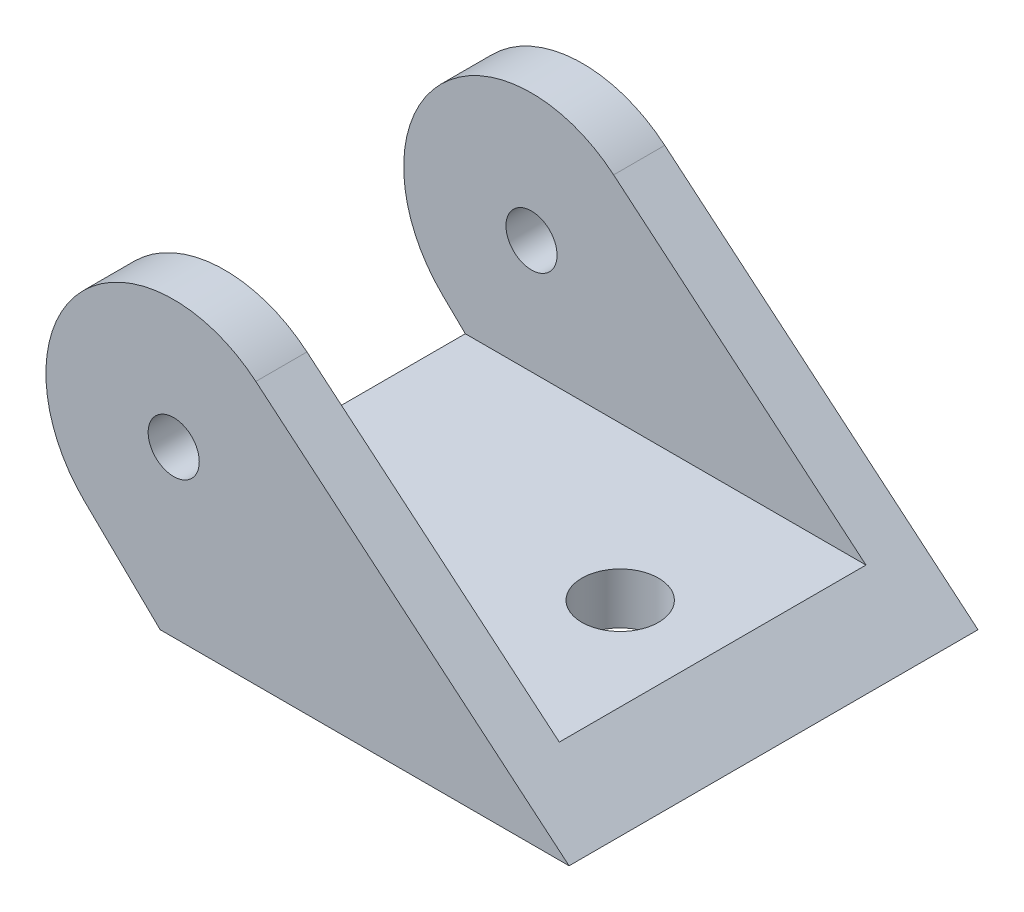
ISO-10303-21;
HEADER;
FILE_DESCRIPTION(('STEP AP214'),'2;1');
FILE_NAME('part.step','',(''),(''),'','','');
FILE_SCHEMA(('AUTOMOTIVE_DESIGN { 1 0 10303 214 1 1 1 1 }'));
ENDSEC;
DATA;
#1=APPLICATION_CONTEXT('core data for automotive mechanical design processes');
#2=APPLICATION_PROTOCOL_DEFINITION('international standard','automotive_design',2000,#1);
#3=PRODUCT_CONTEXT('',#1,'mechanical');
#4=PRODUCT('Part','Part','',(#3));
#5=PRODUCT_RELATED_PRODUCT_CATEGORY('part','',(#4));
#6=PRODUCT_DEFINITION_FORMATION('','',#4);
#7=PRODUCT_DEFINITION_CONTEXT('part definition',#1,'design');
#8=PRODUCT_DEFINITION('design','',#6,#7);
#9=PRODUCT_DEFINITION_SHAPE('','',#8);
#10=(LENGTH_UNIT() NAMED_UNIT(*) SI_UNIT(.MILLI.,.METRE.));
#11=(NAMED_UNIT(*) PLANE_ANGLE_UNIT() SI_UNIT($,.RADIAN.));
#12=(NAMED_UNIT(*) SI_UNIT($,.STERADIAN.) SOLID_ANGLE_UNIT());
#13=UNCERTAINTY_MEASURE_WITH_UNIT(LENGTH_MEASURE(1.E-05),#10,'distance_accuracy_value','');
#14=(GEOMETRIC_REPRESENTATION_CONTEXT(3) GLOBAL_UNCERTAINTY_ASSIGNED_CONTEXT((#13)) GLOBAL_UNIT_ASSIGNED_CONTEXT((#10,
#11,#12)) REPRESENTATION_CONTEXT('',''));
#15=CARTESIAN_POINT('',(0.,0.,0.));
#16=DIRECTION('',(0.,0.,1.));
#17=DIRECTION('',(1.,0.,0.));
#18=AXIS2_PLACEMENT_3D('',#15,#16,#17);
#19=CARTESIAN_POINT('',(1.68068898578198,20.4926550375621,25.4));
#20=DIRECTION('',(0.,0.,-1.));
#21=DIRECTION('',(-1.,0.,0.));
#22=AXIS2_PLACEMENT_3D('',#19,#20,#21);
#23=CYLINDRICAL_SURFACE('',#22,15.875);
#24=DIRECTION('',(0.,0.,-1.));
#25=VECTOR('',#24,1.);
#26=CARTESIAN_POINT('',(-9.37646094583686,9.10164716337904,25.4));
#27=LINE('',#26,#25);
#28=CARTESIAN_POINT('',(-9.37646094583686,9.10164716337904,-19.05));
#29=VERTEX_POINT('',#28);
#30=CARTESIAN_POINT('',(-9.37646094583686,9.10164716337904,-25.4));
#31=VERTEX_POINT('',#30);
#32=EDGE_CURVE('E157',#29,#31,#27,.T.);
#33=ORIENTED_EDGE('',*,*,#32,.F.);
#34=CARTESIAN_POINT('',(1.68068898578198,20.4926550375621,-19.05));
#35=DIRECTION('',(0.,0.,-1.));
#36=DIRECTION('',(-1.,0.,0.));
#37=AXIS2_PLACEMENT_3D('',#34,#35,#36);
#38=CIRCLE('',#37,15.875);
#39=CARTESIAN_POINT('',(11.8849422895557,32.653610572076,-19.05));
#40=VERTEX_POINT('',#39);
#41=EDGE_CURVE('E133',#29,#40,#38,.T.);
#42=ORIENTED_EDGE('',*,*,#41,.T.);
#43=DIRECTION('',(0.,0.,-1.));
#44=VECTOR('',#43,1.);
#45=CARTESIAN_POINT('',(11.8849422895557,32.653610572076,25.4));
#46=LINE('',#45,#44);
#47=CARTESIAN_POINT('',(11.8849422895557,32.653610572076,-25.4));
#48=VERTEX_POINT('',#47);
#49=EDGE_CURVE('E161',#40,#48,#46,.T.);
#50=ORIENTED_EDGE('',*,*,#49,.T.);
#51=CARTESIAN_POINT('',(1.68068898578198,20.4926550375621,-25.4));
#52=DIRECTION('',(0.,0.,1.));
#53=DIRECTION('',(1.,0.,0.));
#54=AXIS2_PLACEMENT_3D('',#51,#52,#53);
#55=CIRCLE('',#54,15.875);
#56=EDGE_CURVE('E152',#48,#31,#55,.T.);
#57=ORIENTED_EDGE('',*,*,#56,.T.);
#58=EDGE_LOOP('',(#33,#42,#50,#57));
#59=FACE_BOUND('',#58,.T.);
#60=ADVANCED_FACE('F35',(#59),#23,.T.);
#61=CARTESIAN_POINT('',(1.68068898578198,20.4926550375621,25.4));
#62=DIRECTION('',(0.,0.,-1.));
#63=DIRECTION('',(-1.,0.,0.));
#64=AXIS2_PLACEMENT_3D('',#61,#62,#63);
#65=CYLINDRICAL_SURFACE('',#64,3.175);
#66=CARTESIAN_POINT('',(1.68068898578198,20.4926550375621,-19.05));
#67=DIRECTION('',(0.,0.,-1.));
#68=DIRECTION('',(-1.,0.,0.));
#69=AXIS2_PLACEMENT_3D('',#66,#67,#68);
#70=CIRCLE('',#69,3.175);
#71=CARTESIAN_POINT('',(-1.49431101421802,20.4926550375621,-19.05));
#72=VERTEX_POINT('',#71);
#73=EDGE_CURVE('E117',#72,#72,#70,.T.);
#74=ORIENTED_EDGE('',*,*,#73,.F.);
#75=EDGE_LOOP('',(#74));
#76=FACE_BOUND('',#75,.T.);
#77=CARTESIAN_POINT('',(1.68068898578198,20.4926550375621,-25.4));
#78=DIRECTION('',(0.,0.,1.));
#79=DIRECTION('',(1.,0.,0.));
#80=AXIS2_PLACEMENT_3D('',#77,#78,#79);
#81=CIRCLE('',#80,3.175);
#82=CARTESIAN_POINT('',(4.85568898578198,20.4926550375621,-25.4));
#83=VERTEX_POINT('',#82);
#84=EDGE_CURVE('E128',#83,#83,#81,.T.);
#85=ORIENTED_EDGE('',*,*,#84,.F.);
#86=EDGE_LOOP('',(#85));
#87=FACE_BOUND('',#86,.T.);
#88=ADVANCED_FACE('F208',(#76,#87),#65,.F.);
#89=CARTESIAN_POINT('',(1.68068898578198,20.4926550375621,25.4));
#90=DIRECTION('',(0.,0.,1.));
#91=DIRECTION('',(1.,0.,0.));
#92=AXIS2_PLACEMENT_3D('',#89,#90,#91);
#93=PLANE('',#92);
#94=DIRECTION('',(1.,0.,0.));
#95=VECTOR('',#94,1.);
#96=CARTESIAN_POINT('',(0.,0.,25.4));
#97=LINE('',#96,#95);
#98=CARTESIAN_POINT('',(0.,0.,25.4));
#99=VERTEX_POINT('',#98);
#100=CARTESIAN_POINT('',(50.8,0.,25.4));
#101=VERTEX_POINT('',#100);
#102=EDGE_CURVE('E140',#99,#101,#97,.T.);
#103=ORIENTED_EDGE('',*,*,#102,.T.);
#104=DIRECTION('',(-0.766044443118982,0.642787609686535,0.));
#105=VECTOR('',#104,1.);
#106=CARTESIAN_POINT('',(50.8,0.,25.4));
#107=LINE('',#106,#105);
#108=CARTESIAN_POINT('',(11.8849422895557,32.653610572076,25.4));
#109=VERTEX_POINT('',#108);
#110=EDGE_CURVE('E86',#101,#109,#107,.T.);
#111=ORIENTED_EDGE('',*,*,#110,.T.);
#112=CARTESIAN_POINT('',(1.68068898578198,20.4926550375621,25.4));
#113=DIRECTION('',(0.,0.,1.));
#114=DIRECTION('',(1.,0.,0.));
#115=AXIS2_PLACEMENT_3D('',#112,#113,#114);
#116=CIRCLE('',#115,15.875);
#117=CARTESIAN_POINT('',(-9.37646094583686,9.10164716337904,25.4));
#118=VERTEX_POINT('',#117);
#119=EDGE_CURVE('E143',#109,#118,#116,.T.);
#120=ORIENTED_EDGE('',*,*,#119,.T.);
#121=DIRECTION('',(0.717543803098148,-0.696513381519297,0.));
#122=VECTOR('',#121,1.);
#123=CARTESIAN_POINT('',(0.,0.,25.4));
#124=LINE('',#123,#122);
#125=EDGE_CURVE('E58',#118,#99,#124,.T.);
#126=ORIENTED_EDGE('',*,*,#125,.T.);
#127=EDGE_LOOP('',(#103,#111,#120,#126));
#128=FACE_BOUND('',#127,.T.);
#129=CARTESIAN_POINT('',(1.68068898578198,20.4926550375621,25.4));
#130=DIRECTION('',(0.,0.,1.));
#131=DIRECTION('',(1.,0.,0.));
#132=AXIS2_PLACEMENT_3D('',#129,#130,#131);
#133=CIRCLE('',#132,3.175);
#134=CARTESIAN_POINT('',(4.85568898578198,20.4926550375621,25.4));
#135=VERTEX_POINT('',#134);
#136=EDGE_CURVE('E131',#135,#135,#133,.T.);
#137=ORIENTED_EDGE('',*,*,#136,.F.);
#138=EDGE_LOOP('',(#137));
#139=FACE_BOUND('',#138,.T.);
#140=ADVANCED_FACE('F216',(#128,#139),#93,.T.);
#141=CARTESIAN_POINT('',(1.68068898578198,20.4926550375621,-25.4));
#142=DIRECTION('',(0.,0.,1.));
#143=DIRECTION('',(1.,0.,0.));
#144=AXIS2_PLACEMENT_3D('',#141,#142,#143);
#145=PLANE('',#144);
#146=DIRECTION('',(1.,0.,0.));
#147=VECTOR('',#146,1.);
#148=CARTESIAN_POINT('',(0.,0.,-25.4));
#149=LINE('',#148,#147);
#150=CARTESIAN_POINT('',(0.,0.,-25.4));
#151=VERTEX_POINT('',#150);
#152=CARTESIAN_POINT('',(50.8,0.,-25.4));
#153=VERTEX_POINT('',#152);
#154=EDGE_CURVE('E138',#151,#153,#149,.T.);
#155=ORIENTED_EDGE('',*,*,#154,.F.);
#156=DIRECTION('',(0.717543803098148,-0.696513381519297,0.));
#157=VECTOR('',#156,1.);
#158=CARTESIAN_POINT('',(0.,0.,-25.4));
#159=LINE('',#158,#157);
#160=EDGE_CURVE('E78',#31,#151,#159,.T.);
#161=ORIENTED_EDGE('',*,*,#160,.F.);
#162=ORIENTED_EDGE('',*,*,#56,.F.);
#163=DIRECTION('',(-0.766044443118982,0.642787609686535,0.));
#164=VECTOR('',#163,1.);
#165=CARTESIAN_POINT('',(50.8,0.,-25.4));
#166=LINE('',#165,#164);
#167=EDGE_CURVE('E149',#153,#48,#166,.T.);
#168=ORIENTED_EDGE('',*,*,#167,.F.);
#169=EDGE_LOOP('',(#155,#161,#162,#168));
#170=FACE_BOUND('',#169,.T.);
#171=ORIENTED_EDGE('',*,*,#84,.T.);
#172=EDGE_LOOP('',(#171));
#173=FACE_BOUND('',#172,.T.);
#174=ADVANCED_FACE('F232',(#170,#173),#145,.F.);
#175=CARTESIAN_POINT('',(0.,0.,25.4));
#176=DIRECTION('',(0.,1.,0.));
#177=DIRECTION('',(0.,0.,1.));
#178=AXIS2_PLACEMENT_3D('',#175,#176,#177);
#179=PLANE('',#178);
#180=CARTESIAN_POINT('',(31.75,0.,0.));
#181=DIRECTION('',(0.,1.,0.));
#182=DIRECTION('',(0.,0.,1.));
#183=AXIS2_PLACEMENT_3D('',#180,#181,#182);
#184=CIRCLE('',#183,4.7625);
#185=CARTESIAN_POINT('',(31.75,0.,4.7625));
#186=VERTEX_POINT('',#185);
#187=EDGE_CURVE('E179',#186,#186,#184,.T.);
#188=ORIENTED_EDGE('',*,*,#187,.T.);
#189=EDGE_LOOP('',(#188));
#190=FACE_BOUND('',#189,.T.);
#191=ORIENTED_EDGE('',*,*,#154,.T.);
#192=DIRECTION('',(0.,0.,-1.));
#193=VECTOR('',#192,1.);
#194=CARTESIAN_POINT('',(50.8,0.,25.4));
#195=LINE('',#194,#193);
#196=EDGE_CURVE('E43',#101,#153,#195,.T.);
#197=ORIENTED_EDGE('',*,*,#196,.F.);
#198=ORIENTED_EDGE('',*,*,#102,.F.);
#199=DIRECTION('',(0.,0.,-1.));
#200=VECTOR('',#199,1.);
#201=CARTESIAN_POINT('',(0.,0.,25.4));
#202=LINE('',#201,#200);
#203=EDGE_CURVE('E146',#99,#151,#202,.T.);
#204=ORIENTED_EDGE('',*,*,#203,.T.);
#205=EDGE_LOOP('',(#191,#197,#198,#204));
#206=FACE_BOUND('',#205,.T.);
#207=ADVANCED_FACE('F37',(#190,#206),#179,.F.);
#208=CARTESIAN_POINT('',(50.8,0.,25.4));
#209=DIRECTION('',(-0.642787609686535,-0.766044443118982,0.));
#210=DIRECTION('',(0.766044443118982,-0.642787609686535,0.));
#211=AXIS2_PLACEMENT_3D('',#208,#209,#210);
#212=PLANE('',#211);
#213=ORIENTED_EDGE('',*,*,#49,.F.);
#214=DIRECTION('',(0.766044443118982,-0.642787609686535,0.));
#215=VECTOR('',#214,1.);
#216=CARTESIAN_POINT('',(50.8,0.,-19.05));
#217=LINE('',#216,#215);
#218=CARTESIAN_POINT('',(43.2323646870267,6.34999999999999,-19.05));
#219=VERTEX_POINT('',#218);
#220=EDGE_CURVE('E127',#40,#219,#217,.T.);
#221=ORIENTED_EDGE('',*,*,#220,.T.);
#222=DIRECTION('',(0.,0.,-1.));
#223=VECTOR('',#222,1.);
#224=CARTESIAN_POINT('',(43.2323646870267,6.35,25.4));
#225=LINE('',#224,#223);
#226=CARTESIAN_POINT('',(43.2323646870267,6.34999999999999,19.05));
#227=VERTEX_POINT('',#226);
#228=EDGE_CURVE('E120',#227,#219,#225,.T.);
#229=ORIENTED_EDGE('',*,*,#228,.F.);
#230=DIRECTION('',(-0.766044443118982,0.642787609686535,0.));
#231=VECTOR('',#230,1.);
#232=CARTESIAN_POINT('',(50.8,0.,19.05));
#233=LINE('',#232,#231);
#234=CARTESIAN_POINT('',(11.8849422895557,32.653610572076,19.05));
#235=VERTEX_POINT('',#234);
#236=EDGE_CURVE('E108',#227,#235,#233,.T.);
#237=ORIENTED_EDGE('',*,*,#236,.T.);
#238=EDGE_CURVE('E162',#109,#235,#46,.T.);
#239=ORIENTED_EDGE('',*,*,#238,.F.);
#240=ORIENTED_EDGE('',*,*,#110,.F.);
#241=ORIENTED_EDGE('',*,*,#196,.T.);
#242=ORIENTED_EDGE('',*,*,#167,.T.);
#243=EDGE_LOOP('',(#213,#221,#229,#237,#239,#240,#241,#242));
#244=FACE_BOUND('',#243,.T.);
#245=ADVANCED_FACE('F126',(#244),#212,.F.);
#246=CARTESIAN_POINT('',(1.68068898578198,20.4926550375621,19.05));
#247=DIRECTION('',(0.,0.,1.));
#248=DIRECTION('',(1.,0.,0.));
#249=AXIS2_PLACEMENT_3D('',#246,#247,#248);
#250=CIRCLE('',#249,15.875);
#251=CARTESIAN_POINT('',(-9.37646094583686,9.10164716337904,19.05));
#252=VERTEX_POINT('',#251);
#253=EDGE_CURVE('E114',#235,#252,#250,.T.);
#254=ORIENTED_EDGE('',*,*,#253,.T.);
#255=EDGE_CURVE('E158',#118,#252,#27,.T.);
#256=ORIENTED_EDGE('',*,*,#255,.F.);
#257=ORIENTED_EDGE('',*,*,#119,.F.);
#258=ORIENTED_EDGE('',*,*,#238,.T.);
#259=EDGE_LOOP('',(#254,#256,#257,#258));
#260=FACE_BOUND('',#259,.T.);
#261=ADVANCED_FACE('F212',(#260),#23,.T.);
#262=CARTESIAN_POINT('',(0.,0.,25.4));
#263=DIRECTION('',(0.696513381519297,0.717543803098148,0.));
#264=DIRECTION('',(-0.717543803098148,0.696513381519297,0.));
#265=AXIS2_PLACEMENT_3D('',#262,#263,#264);
#266=PLANE('',#265);
#267=DIRECTION('',(0.,0.,1.));
#268=VECTOR('',#267,1.);
#269=CARTESIAN_POINT('',(-6.54173095674688,6.35,25.4));
#270=LINE('',#269,#268);
#271=CARTESIAN_POINT('',(-6.54173095674688,6.35,-19.05));
#272=VERTEX_POINT('',#271);
#273=CARTESIAN_POINT('',(-6.54173095674688,6.34999999999999,19.05));
#274=VERTEX_POINT('',#273);
#275=EDGE_CURVE('E12',#272,#274,#270,.T.);
#276=ORIENTED_EDGE('',*,*,#275,.F.);
#277=DIRECTION('',(-0.717543803098148,0.696513381519297,0.));
#278=VECTOR('',#277,1.);
#279=CARTESIAN_POINT('',(0.,0.,-19.05));
#280=LINE('',#279,#278);
#281=EDGE_CURVE('E168',#272,#29,#280,.T.);
#282=ORIENTED_EDGE('',*,*,#281,.T.);
#283=ORIENTED_EDGE('',*,*,#32,.T.);
#284=ORIENTED_EDGE('',*,*,#160,.T.);
#285=ORIENTED_EDGE('',*,*,#203,.F.);
#286=ORIENTED_EDGE('',*,*,#125,.F.);
#287=ORIENTED_EDGE('',*,*,#255,.T.);
#288=DIRECTION('',(0.717543803098148,-0.696513381519297,0.));
#289=VECTOR('',#288,1.);
#290=CARTESIAN_POINT('',(0.,0.,19.05));
#291=LINE('',#290,#289);
#292=EDGE_CURVE('E166',#252,#274,#291,.T.);
#293=ORIENTED_EDGE('',*,*,#292,.T.);
#294=EDGE_LOOP('',(#276,#282,#283,#284,#285,#286,#287,#293));
#295=FACE_BOUND('',#294,.T.);
#296=ADVANCED_FACE('F205',(#295),#266,.F.);
#297=CARTESIAN_POINT('',(1.68068898578198,20.4926550375621,19.05));
#298=DIRECTION('',(0.,0.,1.));
#299=DIRECTION('',(1.,0.,0.));
#300=AXIS2_PLACEMENT_3D('',#297,#298,#299);
#301=CIRCLE('',#300,3.175);
#302=CARTESIAN_POINT('',(4.85568898578198,20.4926550375621,19.05));
#303=VERTEX_POINT('',#302);
#304=EDGE_CURVE('E122',#303,#303,#301,.T.);
#305=ORIENTED_EDGE('',*,*,#304,.F.);
#306=EDGE_LOOP('',(#305));
#307=FACE_BOUND('',#306,.T.);
#308=ORIENTED_EDGE('',*,*,#136,.T.);
#309=EDGE_LOOP('',(#308));
#310=FACE_BOUND('',#309,.T.);
#311=ADVANCED_FACE('F196',(#307,#310),#65,.F.);
#312=CARTESIAN_POINT('',(0.,6.35,25.4));
#313=DIRECTION('',(0.,1.,0.));
#314=DIRECTION('',(0.,0.,1.));
#315=AXIS2_PLACEMENT_3D('',#312,#313,#314);
#316=PLANE('',#315);
#317=CARTESIAN_POINT('',(31.75,6.35,0.));
#318=DIRECTION('',(0.,1.,0.));
#319=DIRECTION('',(0.,0.,1.));
#320=AXIS2_PLACEMENT_3D('',#317,#318,#319);
#321=CIRCLE('',#320,4.7625);
#322=CARTESIAN_POINT('',(31.75,6.35,4.7625));
#323=VERTEX_POINT('',#322);
#324=EDGE_CURVE('E180',#323,#323,#321,.T.);
#325=ORIENTED_EDGE('',*,*,#324,.F.);
#326=EDGE_LOOP('',(#325));
#327=FACE_BOUND('',#326,.T.);
#328=ORIENTED_EDGE('',*,*,#228,.T.);
#329=DIRECTION('',(1.,0.,0.));
#330=VECTOR('',#329,1.);
#331=CARTESIAN_POINT('',(-14.194311014218,6.34999999999999,-19.05));
#332=LINE('',#331,#330);
#333=EDGE_CURVE('E49',#272,#219,#332,.T.);
#334=ORIENTED_EDGE('',*,*,#333,.F.);
#335=ORIENTED_EDGE('',*,*,#275,.T.);
#336=DIRECTION('',(-1.,0.,0.));
#337=VECTOR('',#336,1.);
#338=CARTESIAN_POINT('',(-14.194311014218,6.34999999999999,19.05));
#339=LINE('',#338,#337);
#340=EDGE_CURVE('E112',#227,#274,#339,.T.);
#341=ORIENTED_EDGE('',*,*,#340,.F.);
#342=EDGE_LOOP('',(#328,#334,#335,#341));
#343=FACE_BOUND('',#342,.T.);
#344=ADVANCED_FACE('F119',(#327,#343),#316,.T.);
#345=CARTESIAN_POINT('',(-14.194311014218,-75.3383731189684,-19.05));
#346=DIRECTION('',(0.,0.,-1.));
#347=DIRECTION('',(-1.,0.,0.));
#348=AXIS2_PLACEMENT_3D('',#345,#346,#347);
#349=PLANE('',#348);
#350=ORIENTED_EDGE('',*,*,#73,.T.);
#351=EDGE_LOOP('',(#350));
#352=FACE_BOUND('',#351,.T.);
#353=ORIENTED_EDGE('',*,*,#41,.F.);
#354=ORIENTED_EDGE('',*,*,#281,.F.);
#355=ORIENTED_EDGE('',*,*,#333,.T.);
#356=ORIENTED_EDGE('',*,*,#220,.F.);
#357=EDGE_LOOP('',(#353,#354,#355,#356));
#358=FACE_BOUND('',#357,.T.);
#359=ADVANCED_FACE('F195',(#352,#358),#349,.F.);
#360=CARTESIAN_POINT('',(-14.194311014218,-75.3383731189684,19.05));
#361=DIRECTION('',(0.,0.,1.));
#362=DIRECTION('',(1.,0.,0.));
#363=AXIS2_PLACEMENT_3D('',#360,#361,#362);
#364=PLANE('',#363);
#365=ORIENTED_EDGE('',*,*,#304,.T.);
#366=EDGE_LOOP('',(#365));
#367=FACE_BOUND('',#366,.T.);
#368=ORIENTED_EDGE('',*,*,#340,.T.);
#369=ORIENTED_EDGE('',*,*,#292,.F.);
#370=ORIENTED_EDGE('',*,*,#253,.F.);
#371=ORIENTED_EDGE('',*,*,#236,.F.);
#372=EDGE_LOOP('',(#368,#369,#370,#371));
#373=FACE_BOUND('',#372,.T.);
#374=ADVANCED_FACE('F110',(#367,#373),#364,.F.);
#375=CARTESIAN_POINT('',(31.75,0.,0.));
#376=DIRECTION('',(0.,1.,0.));
#377=DIRECTION('',(0.,0.,1.));
#378=AXIS2_PLACEMENT_3D('',#375,#376,#377);
#379=CYLINDRICAL_SURFACE('',#378,4.7625);
#380=ORIENTED_EDGE('',*,*,#187,.F.);
#381=EDGE_LOOP('',(#380));
#382=FACE_BOUND('',#381,.T.);
#383=ORIENTED_EDGE('',*,*,#324,.T.);
#384=EDGE_LOOP('',(#383));
#385=FACE_BOUND('',#384,.T.);
#386=ADVANCED_FACE('F188',(#382,#385),#379,.F.);
#387=CLOSED_SHELL('',(#60,#88,#140,#174,#207,#245,#261,#296,#311,#344,#359,#374,#386));
#388=MANIFOLD_SOLID_BREP('B2',#387);
#389=ADVANCED_BREP_SHAPE_REPRESENTATION('',(#18,#388),#14);
#390=SHAPE_DEFINITION_REPRESENTATION(#9,#389);
ENDSEC;
END-ISO-10303-21;
